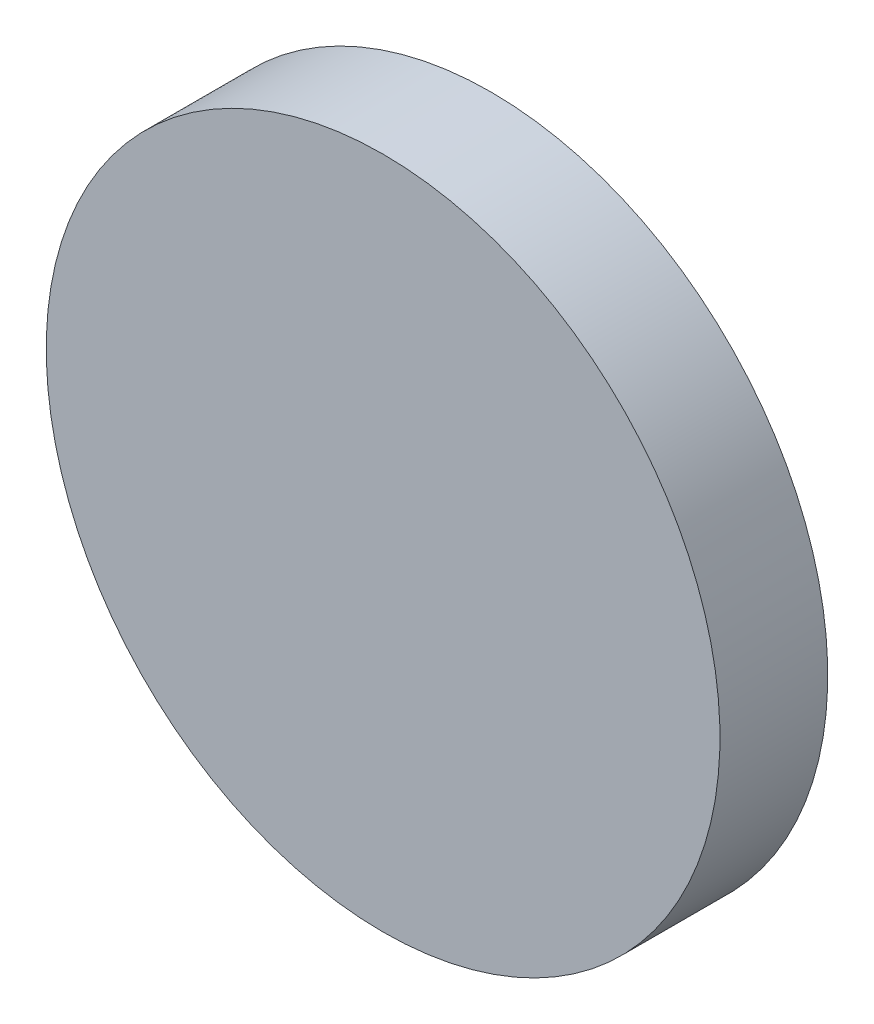
ISO-10303-21;
HEADER;
FILE_DESCRIPTION(('STEP AP214'),'2;1');
FILE_NAME('part.step','',(''),(''),'','','');
FILE_SCHEMA(('AUTOMOTIVE_DESIGN { 1 0 10303 214 1 1 1 1 }'));
ENDSEC;
DATA;
#1=APPLICATION_CONTEXT('core data for automotive mechanical design processes');
#2=APPLICATION_PROTOCOL_DEFINITION('international standard','automotive_design',2000,#1);
#3=PRODUCT_CONTEXT('',#1,'mechanical');
#4=PRODUCT('Part','Part','',(#3));
#5=PRODUCT_RELATED_PRODUCT_CATEGORY('part','',(#4));
#6=PRODUCT_DEFINITION_FORMATION('','',#4);
#7=PRODUCT_DEFINITION_CONTEXT('part definition',#1,'design');
#8=PRODUCT_DEFINITION('design','',#6,#7);
#9=PRODUCT_DEFINITION_SHAPE('','',#8);
#10=(LENGTH_UNIT() NAMED_UNIT(*) SI_UNIT(.MILLI.,.METRE.));
#11=(NAMED_UNIT(*) PLANE_ANGLE_UNIT() SI_UNIT($,.RADIAN.));
#12=(NAMED_UNIT(*) SI_UNIT($,.STERADIAN.) SOLID_ANGLE_UNIT());
#13=UNCERTAINTY_MEASURE_WITH_UNIT(LENGTH_MEASURE(1.E-05),#10,'distance_accuracy_value','');
#14=(GEOMETRIC_REPRESENTATION_CONTEXT(3) GLOBAL_UNCERTAINTY_ASSIGNED_CONTEXT((#13)) GLOBAL_UNIT_ASSIGNED_CONTEXT((#10,
#11,#12)) REPRESENTATION_CONTEXT('',''));
#15=CARTESIAN_POINT('',(0.,0.,0.));
#16=DIRECTION('',(0.,0.,1.));
#17=DIRECTION('',(1.,0.,0.));
#18=AXIS2_PLACEMENT_3D('',#15,#16,#17);
#19=CARTESIAN_POINT('',(0.,0.,0.));
#20=DIRECTION('',(0.,0.,1.));
#21=DIRECTION('',(1.,0.,0.));
#22=AXIS2_PLACEMENT_3D('',#19,#20,#21);
#23=CYLINDRICAL_SURFACE('',#22,12.5);
#24=CARTESIAN_POINT('',(0.,0.,4.));
#25=DIRECTION('',(0.,0.,-1.));
#26=DIRECTION('',(0.,-1.,0.));
#27=AXIS2_PLACEMENT_3D('',#24,#25,#26);
#28=CIRCLE('',#27,12.5);
#29=CARTESIAN_POINT('',(0.,-12.5,4.));
#30=VERTEX_POINT('',#29);
#31=EDGE_CURVE('E9',#30,#30,#28,.T.);
#32=ORIENTED_EDGE('',*,*,#31,.T.);
#33=EDGE_LOOP('',(#32));
#34=FACE_BOUND('',#33,.T.);
#35=CARTESIAN_POINT('',(0.,0.,0.));
#36=DIRECTION('',(0.,0.,-1.));
#37=DIRECTION('',(0.,-1.,0.));
#38=AXIS2_PLACEMENT_3D('',#35,#36,#37);
#39=CIRCLE('',#38,12.5);
#40=CARTESIAN_POINT('',(0.,-12.5,0.));
#41=VERTEX_POINT('',#40);
#42=EDGE_CURVE('E17',#41,#41,#39,.T.);
#43=ORIENTED_EDGE('',*,*,#42,.F.);
#44=EDGE_LOOP('',(#43));
#45=FACE_BOUND('',#44,.T.);
#46=ADVANCED_FACE('F14',(#34,#45),#23,.T.);
#47=CARTESIAN_POINT('',(0.,0.,4.));
#48=DIRECTION('',(0.,0.,-1.));
#49=DIRECTION('',(-1.,0.,0.));
#50=AXIS2_PLACEMENT_3D('',#47,#48,#49);
#51=PLANE('',#50);
#52=ORIENTED_EDGE('',*,*,#31,.F.);
#53=EDGE_LOOP('',(#52));
#54=FACE_BOUND('',#53,.T.);
#55=ADVANCED_FACE('F29',(#54),#51,.F.);
#56=CARTESIAN_POINT('',(0.,0.,0.));
#57=DIRECTION('',(0.,0.,-1.));
#58=DIRECTION('',(-1.,0.,0.));
#59=AXIS2_PLACEMENT_3D('',#56,#57,#58);
#60=PLANE('',#59);
#61=ORIENTED_EDGE('',*,*,#42,.T.);
#62=EDGE_LOOP('',(#61));
#63=FACE_BOUND('',#62,.T.);
#64=ADVANCED_FACE('F26',(#63),#60,.T.);
#65=CLOSED_SHELL('',(#46,#55,#64));
#66=MANIFOLD_SOLID_BREP('B1',#65);
#67=ADVANCED_BREP_SHAPE_REPRESENTATION('',(#18,#66),#14);
#68=SHAPE_DEFINITION_REPRESENTATION(#9,#67);
ENDSEC;
END-ISO-10303-21;
